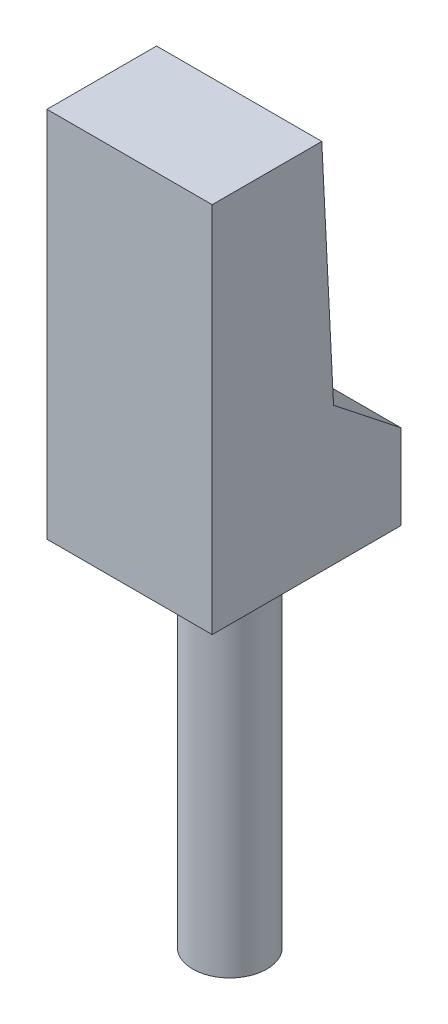
ISO-10303-21;
HEADER;
FILE_DESCRIPTION(('STEP AP214'),'2;1');
FILE_NAME('part.step','',(''),(''),'','','');
FILE_SCHEMA(('AUTOMOTIVE_DESIGN { 1 0 10303 214 1 1 1 1 }'));
ENDSEC;
DATA;
#1=APPLICATION_CONTEXT('core data for automotive mechanical design processes');
#2=APPLICATION_PROTOCOL_DEFINITION('international standard','automotive_design',2000,#1);
#3=PRODUCT_CONTEXT('',#1,'mechanical');
#4=PRODUCT('Part','Part','',(#3));
#5=PRODUCT_RELATED_PRODUCT_CATEGORY('part','',(#4));
#6=PRODUCT_DEFINITION_FORMATION('','',#4);
#7=PRODUCT_DEFINITION_CONTEXT('part definition',#1,'design');
#8=PRODUCT_DEFINITION('design','',#6,#7);
#9=PRODUCT_DEFINITION_SHAPE('','',#8);
#10=(LENGTH_UNIT() NAMED_UNIT(*) SI_UNIT(.MILLI.,.METRE.));
#11=(NAMED_UNIT(*) PLANE_ANGLE_UNIT() SI_UNIT($,.RADIAN.));
#12=(NAMED_UNIT(*) SI_UNIT($,.STERADIAN.) SOLID_ANGLE_UNIT());
#13=UNCERTAINTY_MEASURE_WITH_UNIT(LENGTH_MEASURE(1.E-05),#10,'distance_accuracy_value','');
#14=(GEOMETRIC_REPRESENTATION_CONTEXT(3) GLOBAL_UNCERTAINTY_ASSIGNED_CONTEXT((#13)) GLOBAL_UNIT_ASSIGNED_CONTEXT((#10,
#11,#12)) REPRESENTATION_CONTEXT('',''));
#15=CARTESIAN_POINT('',(0.,0.,0.));
#16=DIRECTION('',(0.,0.,1.));
#17=DIRECTION('',(1.,0.,0.));
#18=AXIS2_PLACEMENT_3D('',#15,#16,#17);
#19=CARTESIAN_POINT('',(0.,40.,0.));
#20=DIRECTION('',(-1.,0.,0.));
#21=DIRECTION('',(0.,0.,1.));
#22=AXIS2_PLACEMENT_3D('',#19,#20,#21);
#23=PLANE('',#22);
#24=DIRECTION('',(0.,-1.,0.));
#25=VECTOR('',#24,1.);
#26=CARTESIAN_POINT('',(0.,40.,-20.2894421875612));
#27=LINE('',#26,#25);
#28=CARTESIAN_POINT('',(0.,9.09351418203474,-20.2894421875612));
#29=VERTEX_POINT('',#28);
#30=CARTESIAN_POINT('',(0.,0.,-20.2894421875612));
#31=VERTEX_POINT('',#30);
#32=EDGE_CURVE('E111',#29,#31,#27,.T.);
#33=ORIENTED_EDGE('',*,*,#32,.F.);
#34=DIRECTION('',(0.,-0.620137212040202,-0.784493364052881));
#35=VECTOR('',#34,1.);
#36=CARTESIAN_POINT('',(0.,3.52661132787802,-27.33175195808));
#37=LINE('',#36,#35);
#38=CARTESIAN_POINT('',(0.,14.8267328585767,-13.0367375939855));
#39=VERTEX_POINT('',#38);
#40=EDGE_CURVE('E137',#39,#29,#37,.T.);
#41=ORIENTED_EDGE('',*,*,#40,.F.);
#42=DIRECTION('',(0.,-0.998743588913783,-0.0501123099010333));
#43=VECTOR('',#42,1.);
#44=CARTESIAN_POINT('',(0.,14.8267328585767,-13.0367375939855));
#45=LINE('',#44,#43);
#46=CARTESIAN_POINT('',(0.,40.,-11.7736600851882));
#47=VERTEX_POINT('',#46);
#48=EDGE_CURVE('E150',#47,#39,#45,.T.);
#49=ORIENTED_EDGE('',*,*,#48,.F.);
#50=DIRECTION('',(0.,0.,-1.));
#51=VECTOR('',#50,1.);
#52=CARTESIAN_POINT('',(0.,40.,0.));
#53=LINE('',#52,#51);
#54=CARTESIAN_POINT('',(0.,40.,0.));
#55=VERTEX_POINT('',#54);
#56=EDGE_CURVE('E85',#55,#47,#53,.T.);
#57=ORIENTED_EDGE('',*,*,#56,.F.);
#58=DIRECTION('',(0.,-1.,0.));
#59=VECTOR('',#58,1.);
#60=CARTESIAN_POINT('',(0.,40.,0.));
#61=LINE('',#60,#59);
#62=CARTESIAN_POINT('',(0.,0.,0.));
#63=VERTEX_POINT('',#62);
#64=EDGE_CURVE('E78',#55,#63,#61,.T.);
#65=ORIENTED_EDGE('',*,*,#64,.T.);
#66=DIRECTION('',(0.,0.,-1.));
#67=VECTOR('',#66,1.);
#68=CARTESIAN_POINT('',(0.,0.,0.));
#69=LINE('',#68,#67);
#70=EDGE_CURVE('E91',#63,#31,#69,.T.);
#71=ORIENTED_EDGE('',*,*,#70,.T.);
#72=EDGE_LOOP('',(#33,#41,#49,#57,#65,#71));
#73=FACE_BOUND('',#72,.T.);
#74=ADVANCED_FACE('F33',(#73),#23,.F.);
#75=CARTESIAN_POINT('',(0.,40.,-20.2894421875612));
#76=DIRECTION('',(0.,0.,1.));
#77=DIRECTION('',(1.,0.,0.));
#78=AXIS2_PLACEMENT_3D('',#75,#76,#77);
#79=PLANE('',#78);
#80=DIRECTION('',(0.,-1.,0.));
#81=VECTOR('',#80,1.);
#82=CARTESIAN_POINT('',(-17.7513604121486,40.,-20.2894421875612));
#83=LINE('',#82,#81);
#84=CARTESIAN_POINT('',(-17.7513604121486,9.09351418203473,-20.2894421875612));
#85=VERTEX_POINT('',#84);
#86=CARTESIAN_POINT('',(-17.7513604121486,0.,-20.2894421875612));
#87=VERTEX_POINT('',#86);
#88=EDGE_CURVE('E109',#85,#87,#83,.T.);
#89=ORIENTED_EDGE('',*,*,#88,.F.);
#90=DIRECTION('',(1.,0.,0.));
#91=VECTOR('',#90,1.);
#92=CARTESIAN_POINT('',(0.,9.09351418203473,-20.2894421875612));
#93=LINE('',#92,#91);
#94=EDGE_CURVE('E102',#85,#29,#93,.T.);
#95=ORIENTED_EDGE('',*,*,#94,.T.);
#96=ORIENTED_EDGE('',*,*,#32,.T.);
#97=DIRECTION('',(-1.,0.,0.));
#98=VECTOR('',#97,1.);
#99=CARTESIAN_POINT('',(0.,0.,-20.2894421875612));
#100=LINE('',#99,#98);
#101=EDGE_CURVE('E97',#31,#87,#100,.T.);
#102=ORIENTED_EDGE('',*,*,#101,.T.);
#103=EDGE_LOOP('',(#89,#95,#96,#102));
#104=FACE_BOUND('',#103,.T.);
#105=ADVANCED_FACE('F131',(#104),#79,.F.);
#106=CARTESIAN_POINT('',(-17.7513604121486,40.,0.));
#107=DIRECTION('',(1.,0.,0.));
#108=DIRECTION('',(0.,0.,-1.));
#109=AXIS2_PLACEMENT_3D('',#106,#107,#108);
#110=PLANE('',#109);
#111=DIRECTION('',(0.,-0.998743588913783,-0.0501123099010333));
#112=VECTOR('',#111,1.);
#113=CARTESIAN_POINT('',(-17.7513604121486,40.5892640136549,-11.7440935566081));
#114=LINE('',#113,#112);
#115=CARTESIAN_POINT('',(-17.7513604121486,40.,-11.7736600851882));
#116=VERTEX_POINT('',#115);
#117=CARTESIAN_POINT('',(-17.7513604121486,14.8267328585767,-13.0367375939855));
#118=VERTEX_POINT('',#117);
#119=EDGE_CURVE('E47',#116,#118,#114,.T.);
#120=ORIENTED_EDGE('',*,*,#119,.T.);
#121=DIRECTION('',(0.,-0.620137212040202,-0.784493364052881));
#122=VECTOR('',#121,1.);
#123=CARTESIAN_POINT('',(-17.7513604121486,30.8499087362225,7.23309124874879));
#124=LINE('',#123,#122);
#125=EDGE_CURVE('E11',#118,#85,#124,.T.);
#126=ORIENTED_EDGE('',*,*,#125,.T.);
#127=ORIENTED_EDGE('',*,*,#88,.T.);
#128=DIRECTION('',(0.,0.,1.));
#129=VECTOR('',#128,1.);
#130=CARTESIAN_POINT('',(-17.7513604121486,0.,0.));
#131=LINE('',#130,#129);
#132=CARTESIAN_POINT('',(-17.7513604121486,0.,0.));
#133=VERTEX_POINT('',#132);
#134=EDGE_CURVE('E86',#87,#133,#131,.T.);
#135=ORIENTED_EDGE('',*,*,#134,.T.);
#136=DIRECTION('',(0.,-1.,0.));
#137=VECTOR('',#136,1.);
#138=CARTESIAN_POINT('',(-17.7513604121486,40.,0.));
#139=LINE('',#138,#137);
#140=CARTESIAN_POINT('',(-17.7513604121486,40.,0.));
#141=VERTEX_POINT('',#140);
#142=EDGE_CURVE('E81',#141,#133,#139,.T.);
#143=ORIENTED_EDGE('',*,*,#142,.F.);
#144=DIRECTION('',(0.,0.,1.));
#145=VECTOR('',#144,1.);
#146=CARTESIAN_POINT('',(-17.7513604121486,40.,0.));
#147=LINE('',#146,#145);
#148=EDGE_CURVE('E122',#116,#141,#147,.T.);
#149=ORIENTED_EDGE('',*,*,#148,.F.);
#150=EDGE_LOOP('',(#120,#126,#127,#135,#143,#149));
#151=FACE_BOUND('',#150,.T.);
#152=ADVANCED_FACE('F126',(#151),#110,.F.);
#153=CARTESIAN_POINT('',(0.,40.,0.));
#154=DIRECTION('',(0.,0.,-1.));
#155=DIRECTION('',(-1.,0.,0.));
#156=AXIS2_PLACEMENT_3D('',#153,#154,#155);
#157=PLANE('',#156);
#158=DIRECTION('',(1.,0.,0.));
#159=VECTOR('',#158,1.);
#160=CARTESIAN_POINT('',(0.,0.,0.));
#161=LINE('',#160,#159);
#162=EDGE_CURVE('E75',#133,#63,#161,.T.);
#163=ORIENTED_EDGE('',*,*,#162,.T.);
#164=ORIENTED_EDGE('',*,*,#64,.F.);
#165=DIRECTION('',(1.,0.,0.));
#166=VECTOR('',#165,1.);
#167=CARTESIAN_POINT('',(0.,40.,0.));
#168=LINE('',#167,#166);
#169=EDGE_CURVE('E56',#141,#55,#168,.T.);
#170=ORIENTED_EDGE('',*,*,#169,.F.);
#171=ORIENTED_EDGE('',*,*,#142,.T.);
#172=EDGE_LOOP('',(#163,#164,#170,#171));
#173=FACE_BOUND('',#172,.T.);
#174=ADVANCED_FACE('F77',(#173),#157,.F.);
#175=CARTESIAN_POINT('',(0.,40.,0.));
#176=DIRECTION('',(0.,1.,0.));
#177=DIRECTION('',(0.,0.,1.));
#178=AXIS2_PLACEMENT_3D('',#175,#176,#177);
#179=PLANE('',#178);
#180=DIRECTION('',(1.,0.,0.));
#181=VECTOR('',#180,1.);
#182=CARTESIAN_POINT('',(0.,40.,-11.7736600851882));
#183=LINE('',#182,#181);
#184=EDGE_CURVE('E40',#116,#47,#183,.T.);
#185=ORIENTED_EDGE('',*,*,#184,.F.);
#186=ORIENTED_EDGE('',*,*,#148,.T.);
#187=ORIENTED_EDGE('',*,*,#169,.T.);
#188=ORIENTED_EDGE('',*,*,#56,.T.);
#189=EDGE_LOOP('',(#185,#186,#187,#188));
#190=FACE_BOUND('',#189,.T.);
#191=ADVANCED_FACE('F124',(#190),#179,.T.);
#192=CARTESIAN_POINT('',(0.,0.,0.));
#193=DIRECTION('',(0.,1.,0.));
#194=DIRECTION('',(0.,0.,1.));
#195=AXIS2_PLACEMENT_3D('',#192,#193,#194);
#196=PLANE('',#195);
#197=CARTESIAN_POINT('',(-8.63600649825003,0.,-10.5304358659168));
#198=DIRECTION('',(0.,-1.,0.));
#199=DIRECTION('',(0.,0.,-1.));
#200=AXIS2_PLACEMENT_3D('',#197,#198,#199);
#201=CIRCLE('',#200,3.98081488708613);
#202=CARTESIAN_POINT('',(-8.63600649825003,0.,-14.511250753003));
#203=VERTEX_POINT('',#202);
#204=EDGE_CURVE('E112',#203,#203,#201,.T.);
#205=ORIENTED_EDGE('',*,*,#204,.F.);
#206=EDGE_LOOP('',(#205));
#207=FACE_BOUND('',#206,.T.);
#208=ORIENTED_EDGE('',*,*,#70,.F.);
#209=ORIENTED_EDGE('',*,*,#162,.F.);
#210=ORIENTED_EDGE('',*,*,#134,.F.);
#211=ORIENTED_EDGE('',*,*,#101,.F.);
#212=EDGE_LOOP('',(#208,#209,#210,#211));
#213=FACE_BOUND('',#212,.T.);
#214=ADVANCED_FACE('F95',(#207,#213),#196,.F.);
#215=CARTESIAN_POINT('',(-8.63600649825003,-38.7165260938502,-10.5304358659168));
#216=DIRECTION('',(0.,-1.,0.));
#217=DIRECTION('',(0.,0.,-1.));
#218=AXIS2_PLACEMENT_3D('',#215,#216,#217);
#219=PLANE('',#218);
#220=CARTESIAN_POINT('',(-8.63600649825003,-38.7165260938502,-10.5304358659168));
#221=DIRECTION('',(0.,-1.,0.));
#222=DIRECTION('',(0.,0.,-1.));
#223=AXIS2_PLACEMENT_3D('',#220,#221,#222);
#224=CIRCLE('',#223,3.98081488708613);
#225=CARTESIAN_POINT('',(-8.63600649825003,-38.7165260938502,-14.511250753003));
#226=VERTEX_POINT('',#225);
#227=EDGE_CURVE('E98',#226,#226,#224,.T.);
#228=ORIENTED_EDGE('',*,*,#227,.T.);
#229=EDGE_LOOP('',(#228));
#230=FACE_BOUND('',#229,.T.);
#231=ADVANCED_FACE('F159',(#230),#219,.T.);
#232=CARTESIAN_POINT('',(-8.63600649825003,0.,-10.5304358659168));
#233=DIRECTION('',(0.,-1.,0.));
#234=DIRECTION('',(0.,0.,-1.));
#235=AXIS2_PLACEMENT_3D('',#232,#233,#234);
#236=CYLINDRICAL_SURFACE('',#235,3.98081488708613);
#237=ORIENTED_EDGE('',*,*,#227,.F.);
#238=EDGE_LOOP('',(#237));
#239=FACE_BOUND('',#238,.T.);
#240=ORIENTED_EDGE('',*,*,#204,.T.);
#241=EDGE_LOOP('',(#240));
#242=FACE_BOUND('',#241,.T.);
#243=ADVANCED_FACE('F157',(#239,#242),#236,.T.);
#244=CARTESIAN_POINT('',(-40.,3.52661132787802,-27.33175195808));
#245=DIRECTION('',(0.,-0.784493364052881,0.620137212040202));
#246=DIRECTION('',(0.,-0.620137212040202,-0.784493364052881));
#247=AXIS2_PLACEMENT_3D('',#244,#245,#246);
#248=PLANE('',#247);
#249=ORIENTED_EDGE('',*,*,#125,.F.);
#250=DIRECTION('',(1.,0.,0.));
#251=VECTOR('',#250,1.);
#252=CARTESIAN_POINT('',(-40.,14.8267328585767,-13.0367375939855));
#253=LINE('',#252,#251);
#254=EDGE_CURVE('E146',#118,#39,#253,.T.);
#255=ORIENTED_EDGE('',*,*,#254,.T.);
#256=ORIENTED_EDGE('',*,*,#40,.T.);
#257=ORIENTED_EDGE('',*,*,#94,.F.);
#258=EDGE_LOOP('',(#249,#255,#256,#257));
#259=FACE_BOUND('',#258,.T.);
#260=ADVANCED_FACE('F145',(#259),#248,.F.);
#261=CARTESIAN_POINT('',(-40.,14.8267328585767,-13.0367375939855));
#262=DIRECTION('',(0.,-0.0501123099010333,0.998743588913783));
#263=DIRECTION('',(0.,-0.998743588913783,-0.0501123099010333));
#264=AXIS2_PLACEMENT_3D('',#261,#262,#263);
#265=PLANE('',#264);
#266=ORIENTED_EDGE('',*,*,#184,.T.);
#267=ORIENTED_EDGE('',*,*,#48,.T.);
#268=ORIENTED_EDGE('',*,*,#254,.F.);
#269=ORIENTED_EDGE('',*,*,#119,.F.);
#270=EDGE_LOOP('',(#266,#267,#268,#269));
#271=FACE_BOUND('',#270,.T.);
#272=ADVANCED_FACE('F151',(#271),#265,.F.);
#273=CLOSED_SHELL('',(#74,#105,#152,#174,#191,#214,#231,#243,#260,#272));
#274=MANIFOLD_SOLID_BREP('B2',#273);
#275=ADVANCED_BREP_SHAPE_REPRESENTATION('',(#18,#274),#14);
#276=SHAPE_DEFINITION_REPRESENTATION(#9,#275);
ENDSEC;
END-ISO-10303-21;
